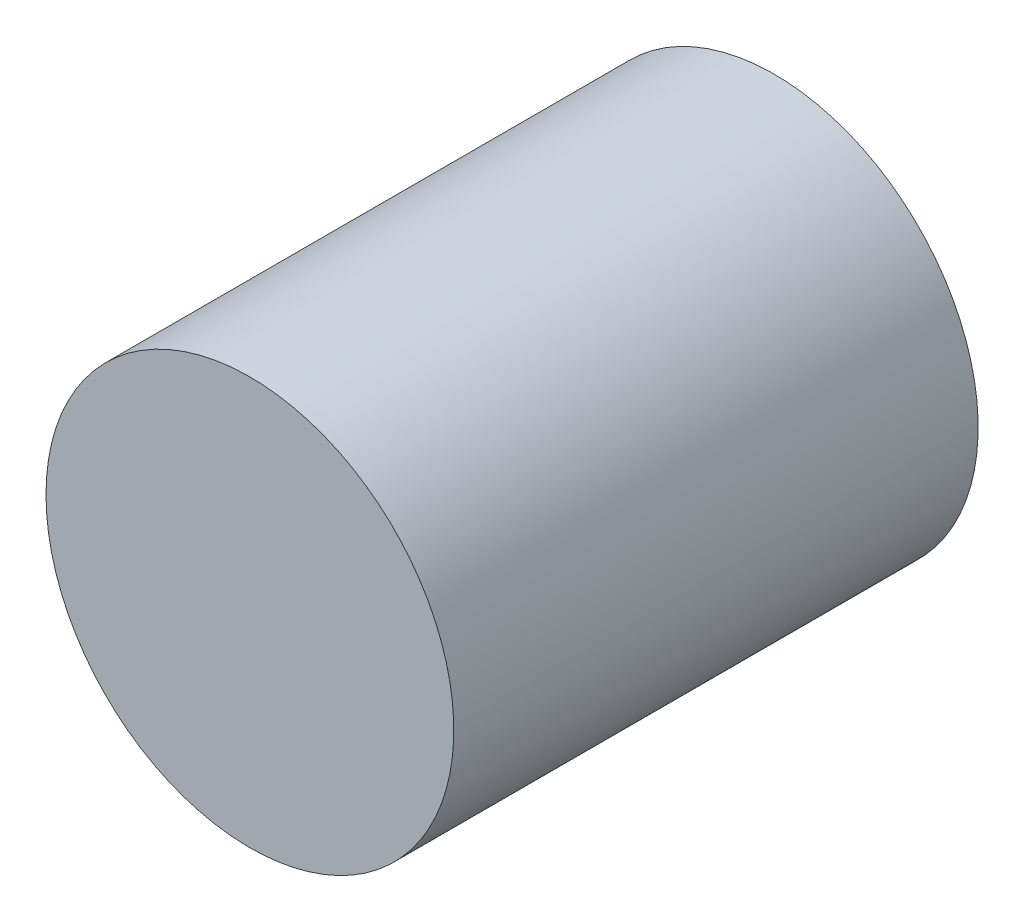
ISO-10303-21;
HEADER;
FILE_DESCRIPTION(('STEP AP214'),'2;1');
FILE_NAME('part.step','',(''),(''),'','','');
FILE_SCHEMA(('AUTOMOTIVE_DESIGN { 1 0 10303 214 1 1 1 1 }'));
ENDSEC;
DATA;
#1=APPLICATION_CONTEXT('core data for automotive mechanical design processes');
#2=APPLICATION_PROTOCOL_DEFINITION('international standard','automotive_design',2000,#1);
#3=PRODUCT_CONTEXT('',#1,'mechanical');
#4=PRODUCT('Part','Part','',(#3));
#5=PRODUCT_RELATED_PRODUCT_CATEGORY('part','',(#4));
#6=PRODUCT_DEFINITION_FORMATION('','',#4);
#7=PRODUCT_DEFINITION_CONTEXT('part definition',#1,'design');
#8=PRODUCT_DEFINITION('design','',#6,#7);
#9=PRODUCT_DEFINITION_SHAPE('','',#8);
#10=(LENGTH_UNIT() NAMED_UNIT(*) SI_UNIT(.MILLI.,.METRE.));
#11=(NAMED_UNIT(*) PLANE_ANGLE_UNIT() SI_UNIT($,.RADIAN.));
#12=(NAMED_UNIT(*) SI_UNIT($,.STERADIAN.) SOLID_ANGLE_UNIT());
#13=UNCERTAINTY_MEASURE_WITH_UNIT(LENGTH_MEASURE(1.E-05),#10,'distance_accuracy_value','');
#14=(GEOMETRIC_REPRESENTATION_CONTEXT(3) GLOBAL_UNCERTAINTY_ASSIGNED_CONTEXT((#13)) GLOBAL_UNIT_ASSIGNED_CONTEXT((#10,
#11,#12)) REPRESENTATION_CONTEXT('',''));
#15=CARTESIAN_POINT('',(0.,0.,0.));
#16=DIRECTION('',(0.,0.,1.));
#17=DIRECTION('',(1.,0.,0.));
#18=AXIS2_PLACEMENT_3D('',#15,#16,#17);
#19=CARTESIAN_POINT('',(5.24999966,0.,0.));
#20=DIRECTION('',(0.,0.,-1.));
#21=DIRECTION('',(-1.,0.,0.));
#22=AXIS2_PLACEMENT_3D('',#19,#20,#21);
#23=PLANE('',#22);
#24=CARTESIAN_POINT('',(0.,0.,0.));
#25=DIRECTION('',(0.,0.,-1.));
#26=DIRECTION('',(-1.,0.,0.));
#27=AXIS2_PLACEMENT_3D('',#24,#25,#26);
#28=CIRCLE('',#27,5.24999966);
#29=CARTESIAN_POINT('',(-5.24999966,0.,0.));
#30=VERTEX_POINT('',#29);
#31=EDGE_CURVE('E18',#30,#30,#28,.F.);
#32=ORIENTED_EDGE('',*,*,#31,.F.);
#33=EDGE_LOOP('',(#32));
#34=FACE_BOUND('',#33,.T.);
#35=ADVANCED_FACE('F15',(#34),#23,.T.);
#36=CARTESIAN_POINT('',(5.24999966,0.,13.50000094));
#37=DIRECTION('',(0.,0.,-1.));
#38=DIRECTION('',(-1.,0.,0.));
#39=AXIS2_PLACEMENT_3D('',#36,#37,#38);
#40=PLANE('',#39);
#41=CARTESIAN_POINT('',(0.,0.,13.50000094));
#42=DIRECTION('',(0.,0.,-1.));
#43=DIRECTION('',(-1.,0.,0.));
#44=AXIS2_PLACEMENT_3D('',#41,#42,#43);
#45=CIRCLE('',#44,5.24999966);
#46=CARTESIAN_POINT('',(-5.24999966,0.,13.50000094));
#47=VERTEX_POINT('',#46);
#48=EDGE_CURVE('E10',#47,#47,#45,.T.);
#49=ORIENTED_EDGE('',*,*,#48,.F.);
#50=EDGE_LOOP('',(#49));
#51=FACE_BOUND('',#50,.T.);
#52=ADVANCED_FACE('F30',(#51),#40,.F.);
#53=CARTESIAN_POINT('',(0.,0.,0.));
#54=DIRECTION('',(0.,0.,-1.));
#55=DIRECTION('',(-1.,0.,0.));
#56=AXIS2_PLACEMENT_3D('',#53,#54,#55);
#57=CYLINDRICAL_SURFACE('',#56,5.24999966);
#58=ORIENTED_EDGE('',*,*,#48,.T.);
#59=EDGE_LOOP('',(#58));
#60=FACE_BOUND('',#59,.T.);
#61=ORIENTED_EDGE('',*,*,#31,.T.);
#62=EDGE_LOOP('',(#61));
#63=FACE_BOUND('',#62,.T.);
#64=ADVANCED_FACE('F27',(#60,#63),#57,.T.);
#65=CLOSED_SHELL('',(#35,#52,#64));
#66=MANIFOLD_SOLID_BREP('B1',#65);
#67=ADVANCED_BREP_SHAPE_REPRESENTATION('',(#18,#66),#14);
#68=SHAPE_DEFINITION_REPRESENTATION(#9,#67);
ENDSEC;
END-ISO-10303-21;
